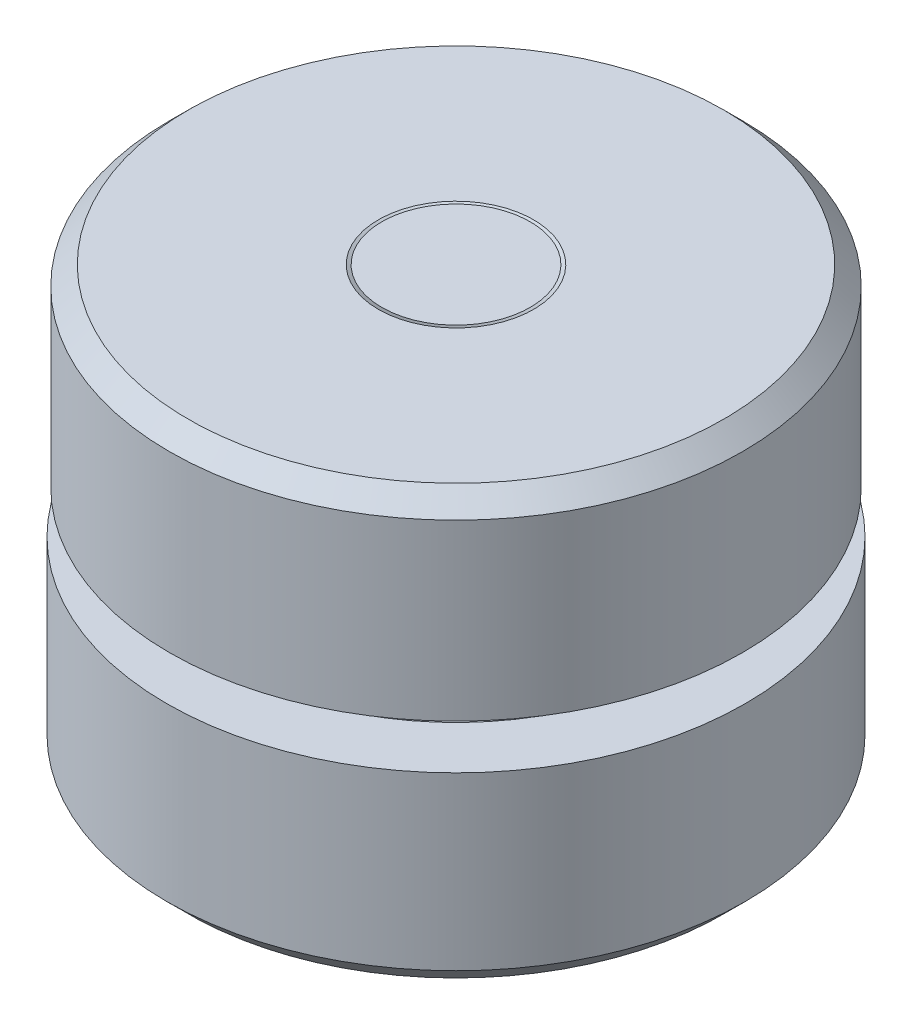
ISO-10303-21;
HEADER;
FILE_DESCRIPTION(('STEP AP214'),'2;1');
FILE_NAME('part.step','',(''),(''),'','','');
FILE_SCHEMA(('AUTOMOTIVE_DESIGN { 1 0 10303 214 1 1 1 1 }'));
ENDSEC;
DATA;
#1=APPLICATION_CONTEXT('core data for automotive mechanical design processes');
#2=APPLICATION_PROTOCOL_DEFINITION('international standard','automotive_design',2000,#1);
#3=PRODUCT_CONTEXT('',#1,'mechanical');
#4=PRODUCT('Part','Part','',(#3));
#5=PRODUCT_RELATED_PRODUCT_CATEGORY('part','',(#4));
#6=PRODUCT_DEFINITION_FORMATION('','',#4);
#7=PRODUCT_DEFINITION_CONTEXT('part definition',#1,'design');
#8=PRODUCT_DEFINITION('design','',#6,#7);
#9=PRODUCT_DEFINITION_SHAPE('','',#8);
#10=(LENGTH_UNIT() NAMED_UNIT(*) SI_UNIT(.MILLI.,.METRE.));
#11=(NAMED_UNIT(*) PLANE_ANGLE_UNIT() SI_UNIT($,.RADIAN.));
#12=(NAMED_UNIT(*) SI_UNIT($,.STERADIAN.) SOLID_ANGLE_UNIT());
#13=UNCERTAINTY_MEASURE_WITH_UNIT(LENGTH_MEASURE(1.E-05),#10,'distance_accuracy_value','');
#14=(GEOMETRIC_REPRESENTATION_CONTEXT(3) GLOBAL_UNCERTAINTY_ASSIGNED_CONTEXT((#13)) GLOBAL_UNIT_ASSIGNED_CONTEXT((#10,
#11,#12)) REPRESENTATION_CONTEXT('',''));
#15=CARTESIAN_POINT('',(0.,0.,0.));
#16=DIRECTION('',(0.,0.,1.));
#17=DIRECTION('',(1.,0.,0.));
#18=AXIS2_PLACEMENT_3D('',#15,#16,#17);
#19=CARTESIAN_POINT('',(0.,15.875,0.));
#20=DIRECTION('',(0.,-1.,0.));
#21=DIRECTION('',(0.,0.,-1.));
#22=AXIS2_PLACEMENT_3D('',#19,#20,#21);
#23=CONICAL_SURFACE('',#22,19.84375,0.78539816339745);
#24=CARTESIAN_POINT('',(0.,15.875,0.));
#25=DIRECTION('',(0.,-1.,0.));
#26=DIRECTION('',(0.,0.,-1.));
#27=AXIS2_PLACEMENT_3D('',#24,#25,#26);
#28=CIRCLE('',#27,19.84375);
#29=CARTESIAN_POINT('',(0.,15.875,-19.84375));
#30=VERTEX_POINT('',#29);
#31=EDGE_CURVE('E52',#30,#30,#28,.T.);
#32=ORIENTED_EDGE('',*,*,#31,.T.);
#33=EDGE_LOOP('',(#32));
#34=FACE_BOUND('',#33,.T.);
#35=CARTESIAN_POINT('',(0.,14.4859375,0.));
#36=DIRECTION('',(0.,-1.,0.));
#37=DIRECTION('',(0.,0.,-1.));
#38=AXIS2_PLACEMENT_3D('',#35,#36,#37);
#39=CIRCLE('',#38,21.2328125);
#40=CARTESIAN_POINT('',(0.,14.4859375,-21.2328125));
#41=VERTEX_POINT('',#40);
#42=EDGE_CURVE('E65',#41,#41,#39,.T.);
#43=ORIENTED_EDGE('',*,*,#42,.F.);
#44=EDGE_LOOP('',(#43));
#45=FACE_BOUND('',#44,.T.);
#46=ADVANCED_FACE('F41',(#34,#45),#23,.T.);
#47=CARTESIAN_POINT('',(0.,1.5875,16.8639860621043));
#48=DIRECTION('',(0.,1.,0.));
#49=DIRECTION('',(0.,0.,1.));
#50=AXIS2_PLACEMENT_3D('',#47,#48,#49);
#51=PLANE('',#50);
#52=CARTESIAN_POINT('',(0.,1.5875,0.));
#53=DIRECTION('',(0.,-1.,0.));
#54=DIRECTION('',(0.,0.,-1.));
#55=AXIS2_PLACEMENT_3D('',#52,#53,#54);
#56=CIRCLE('',#55,16.8639860621043);
#57=CARTESIAN_POINT('',(0.,1.5875,-16.8639860621043));
#58=VERTEX_POINT('',#57);
#59=EDGE_CURVE('E54',#58,#58,#56,.T.);
#60=ORIENTED_EDGE('',*,*,#59,.F.);
#61=EDGE_LOOP('',(#60));
#62=FACE_BOUND('',#61,.T.);
#63=CARTESIAN_POINT('',(0.,1.5875,0.));
#64=DIRECTION('',(0.,-1.,0.));
#65=DIRECTION('',(0.,0.,-1.));
#66=AXIS2_PLACEMENT_3D('',#63,#64,#65);
#67=CIRCLE('',#66,21.2328125);
#68=CARTESIAN_POINT('',(0.,1.58750000000001,-21.2328125));
#69=VERTEX_POINT('',#68);
#70=EDGE_CURVE('E68',#69,#69,#67,.T.);
#71=ORIENTED_EDGE('',*,*,#70,.T.);
#72=EDGE_LOOP('',(#71));
#73=FACE_BOUND('',#72,.T.);
#74=ADVANCED_FACE('F72',(#62,#73),#51,.F.);
#75=CARTESIAN_POINT('',(0.,1.5875,0.));
#76=DIRECTION('',(0.,1.,0.));
#77=DIRECTION('',(0.,0.,1.));
#78=AXIS2_PLACEMENT_3D('',#75,#76,#77);
#79=PLANE('',#78);
#80=CARTESIAN_POINT('',(0.,1.5875,0.));
#81=DIRECTION('',(0.,1.,0.));
#82=DIRECTION('',(0.,0.,1.));
#83=AXIS2_PLACEMENT_3D('',#80,#81,#82);
#84=CIRCLE('',#83,3.0036306570156);
#85=CARTESIAN_POINT('',(0.,1.5875,3.0036306570156));
#86=VERTEX_POINT('',#85);
#87=EDGE_CURVE('E62',#86,#86,#84,.T.);
#88=ORIENTED_EDGE('',*,*,#87,.T.);
#89=EDGE_LOOP('',(#88));
#90=FACE_BOUND('',#89,.T.);
#91=CARTESIAN_POINT('',(0.,1.5875,0.));
#92=DIRECTION('',(0.,-1.,0.));
#93=DIRECTION('',(0.,0.,-1.));
#94=AXIS2_PLACEMENT_3D('',#91,#92,#93);
#95=CIRCLE('',#94,4.56726393789573);
#96=CARTESIAN_POINT('',(0.,1.5875,-4.56726393789573));
#97=VERTEX_POINT('',#96);
#98=EDGE_CURVE('E57',#97,#97,#95,.T.);
#99=ORIENTED_EDGE('',*,*,#98,.T.);
#100=EDGE_LOOP('',(#99));
#101=FACE_BOUND('',#100,.T.);
#102=ADVANCED_FACE('F43',(#90,#101),#79,.F.);
#103=CARTESIAN_POINT('',(0.,15.875,19.84375));
#104=DIRECTION('',(0.,-1.,0.));
#105=DIRECTION('',(0.,0.,-1.));
#106=AXIS2_PLACEMENT_3D('',#103,#104,#105);
#107=PLANE('',#106);
#108=CARTESIAN_POINT('',(0.,15.875,0.));
#109=DIRECTION('',(0.,1.,0.));
#110=DIRECTION('',(0.,0.,1.));
#111=AXIS2_PLACEMENT_3D('',#108,#109,#110);
#112=CIRCLE('',#111,5.7532613140312);
#113=CARTESIAN_POINT('',(0.,15.875,5.7532613140312));
#114=VERTEX_POINT('',#113);
#115=EDGE_CURVE('E11',#114,#114,#112,.T.);
#116=ORIENTED_EDGE('',*,*,#115,.F.);
#117=EDGE_LOOP('',(#116));
#118=FACE_BOUND('',#117,.T.);
#119=ORIENTED_EDGE('',*,*,#31,.F.);
#120=EDGE_LOOP('',(#119));
#121=FACE_BOUND('',#120,.T.);
#122=ADVANCED_FACE('F98',(#118,#121),#107,.F.);
#123=CARTESIAN_POINT('',(0.,0.,0.));
#124=DIRECTION('',(0.,-1.,0.));
#125=DIRECTION('',(0.,0.,-1.));
#126=AXIS2_PLACEMENT_3D('',#123,#124,#125);
#127=TOROIDAL_SURFACE('',#126,10.715625,6.35);
#128=ORIENTED_EDGE('',*,*,#98,.F.);
#129=EDGE_LOOP('',(#128));
#130=FACE_BOUND('',#129,.T.);
#131=ORIENTED_EDGE('',*,*,#59,.T.);
#132=EDGE_LOOP('',(#131));
#133=FACE_BOUND('',#132,.T.);
#134=ADVANCED_FACE('F90',(#130,#133),#127,.F.);
#135=CARTESIAN_POINT('',(0.,15.875,0.));
#136=DIRECTION('',(0.,1.,0.));
#137=DIRECTION('',(0.,0.,1.));
#138=AXIS2_PLACEMENT_3D('',#135,#136,#137);
#139=CYLINDRICAL_SURFACE('',#138,3.0036306570156);
#140=CARTESIAN_POINT('',(0.,14.2875,0.));
#141=DIRECTION('',(0.,1.,0.));
#142=DIRECTION('',(0.,0.,1.));
#143=AXIS2_PLACEMENT_3D('',#140,#141,#142);
#144=CIRCLE('',#143,3.0036306570156);
#145=CARTESIAN_POINT('',(0.,14.2875,3.0036306570156));
#146=VERTEX_POINT('',#145);
#147=EDGE_CURVE('E45',#146,#146,#144,.T.);
#148=ORIENTED_EDGE('',*,*,#147,.T.);
#149=EDGE_LOOP('',(#148));
#150=FACE_BOUND('',#149,.T.);
#151=ORIENTED_EDGE('',*,*,#87,.F.);
#152=EDGE_LOOP('',(#151));
#153=FACE_BOUND('',#152,.T.);
#154=ADVANCED_FACE('F94',(#150,#153),#139,.F.);
#155=CARTESIAN_POINT('',(0.,15.875,0.));
#156=DIRECTION('',(0.,1.,0.));
#157=DIRECTION('',(0.,0.,1.));
#158=AXIS2_PLACEMENT_3D('',#155,#156,#157);
#159=CONICAL_SURFACE('',#158,5.7532613140312,1.0471975511966);
#160=ORIENTED_EDGE('',*,*,#147,.F.);
#161=EDGE_LOOP('',(#160));
#162=FACE_BOUND('',#161,.T.);
#163=ORIENTED_EDGE('',*,*,#115,.T.);
#164=EDGE_LOOP('',(#163));
#165=FACE_BOUND('',#164,.T.);
#166=ADVANCED_FACE('F77',(#162,#165),#159,.F.);
#167=CARTESIAN_POINT('',(0.,-15.875,0.));
#168=DIRECTION('',(0.,-1.,0.));
#169=DIRECTION('',(0.,0.,-1.));
#170=AXIS2_PLACEMENT_3D('',#167,#168,#169);
#171=CYLINDRICAL_SURFACE('',#170,21.2328125);
#172=ORIENTED_EDGE('',*,*,#70,.F.);
#173=EDGE_LOOP('',(#172));
#174=FACE_BOUND('',#173,.T.);
#175=ORIENTED_EDGE('',*,*,#42,.T.);
#176=EDGE_LOOP('',(#175));
#177=FACE_BOUND('',#176,.T.);
#178=ADVANCED_FACE('F74',(#174,#177),#171,.T.);
#179=CLOSED_SHELL('',(#46,#74,#102,#122,#134,#154,#166,#178));
#180=MANIFOLD_SOLID_BREP('B2',#179);
#181=CARTESIAN_POINT('',(0.,-15.875,19.84375));
#182=DIRECTION('',(0.,1.,0.));
#183=DIRECTION('',(0.,0.,1.));
#184=AXIS2_PLACEMENT_3D('',#181,#182,#183);
#185=PLANE('',#184);
#186=CARTESIAN_POINT('',(0.,-15.875,0.));
#187=DIRECTION('',(0.,1.,0.));
#188=DIRECTION('',(0.,0.,1.));
#189=AXIS2_PLACEMENT_3D('',#186,#187,#188);
#190=CIRCLE('',#189,5.7532613140312);
#191=CARTESIAN_POINT('',(0.,-15.875,5.7532613140312));
#192=VERTEX_POINT('',#191);
#193=EDGE_CURVE('E171',#192,#192,#190,.T.);
#194=ORIENTED_EDGE('',*,*,#193,.T.);
#195=EDGE_LOOP('',(#194));
#196=FACE_BOUND('',#195,.T.);
#197=CARTESIAN_POINT('',(0.,-15.875,0.));
#198=DIRECTION('',(0.,-1.,0.));
#199=DIRECTION('',(0.,0.,-1.));
#200=AXIS2_PLACEMENT_3D('',#197,#198,#199);
#201=CIRCLE('',#200,19.84375);
#202=CARTESIAN_POINT('',(0.,-15.875,-19.84375));
#203=VERTEX_POINT('',#202);
#204=EDGE_CURVE('E191',#203,#203,#201,.T.);
#205=ORIENTED_EDGE('',*,*,#204,.T.);
#206=EDGE_LOOP('',(#205));
#207=FACE_BOUND('',#206,.T.);
#208=ADVANCED_FACE('F168',(#196,#207),#185,.F.);
#209=CARTESIAN_POINT('',(0.,-1.5875,0.));
#210=DIRECTION('',(0.,-1.,0.));
#211=DIRECTION('',(0.,0.,-1.));
#212=AXIS2_PLACEMENT_3D('',#209,#210,#211);
#213=PLANE('',#212);
#214=CARTESIAN_POINT('',(0.,-1.5875,0.));
#215=DIRECTION('',(0.,-1.,0.));
#216=DIRECTION('',(0.,0.,-1.));
#217=AXIS2_PLACEMENT_3D('',#214,#215,#216);
#218=CIRCLE('',#217,3.0036306570156);
#219=CARTESIAN_POINT('',(0.,-1.5875,-3.0036306570156));
#220=VERTEX_POINT('',#219);
#221=EDGE_CURVE('E190',#220,#220,#218,.T.);
#222=ORIENTED_EDGE('',*,*,#221,.T.);
#223=EDGE_LOOP('',(#222));
#224=FACE_BOUND('',#223,.T.);
#225=CARTESIAN_POINT('',(0.,-1.5875,0.));
#226=DIRECTION('',(0.,-1.,0.));
#227=DIRECTION('',(0.,0.,-1.));
#228=AXIS2_PLACEMENT_3D('',#225,#226,#227);
#229=CIRCLE('',#228,4.56726393789573);
#230=CARTESIAN_POINT('',(0.,-1.5875,-4.56726393789573));
#231=VERTEX_POINT('',#230);
#232=EDGE_CURVE('E175',#231,#231,#229,.T.);
#233=ORIENTED_EDGE('',*,*,#232,.F.);
#234=EDGE_LOOP('',(#233));
#235=FACE_BOUND('',#234,.T.);
#236=ADVANCED_FACE('F197',(#224,#235),#213,.F.);
#237=CARTESIAN_POINT('',(0.,-14.2875,0.));
#238=DIRECTION('',(0.,1.,0.));
#239=DIRECTION('',(0.,0.,1.));
#240=AXIS2_PLACEMENT_3D('',#237,#238,#239);
#241=CONICAL_SURFACE('',#240,21.43125,0.78539816339745);
#242=ORIENTED_EDGE('',*,*,#204,.F.);
#243=EDGE_LOOP('',(#242));
#244=FACE_BOUND('',#243,.T.);
#245=CARTESIAN_POINT('',(0.,-14.2875,0.));
#246=DIRECTION('',(0.,-1.,0.));
#247=DIRECTION('',(0.,0.,-1.));
#248=AXIS2_PLACEMENT_3D('',#245,#246,#247);
#249=CIRCLE('',#248,21.43125);
#250=CARTESIAN_POINT('',(0.,-14.2875,-21.43125));
#251=VERTEX_POINT('',#250);
#252=EDGE_CURVE('E187',#251,#251,#249,.T.);
#253=ORIENTED_EDGE('',*,*,#252,.T.);
#254=EDGE_LOOP('',(#253));
#255=FACE_BOUND('',#254,.T.);
#256=ADVANCED_FACE('F220',(#244,#255),#241,.T.);
#257=CARTESIAN_POINT('',(0.,-15.875,0.));
#258=DIRECTION('',(0.,-1.,0.));
#259=DIRECTION('',(0.,0.,-1.));
#260=AXIS2_PLACEMENT_3D('',#257,#258,#259);
#261=CYLINDRICAL_SURFACE('',#260,21.43125);
#262=ORIENTED_EDGE('',*,*,#252,.F.);
#263=EDGE_LOOP('',(#262));
#264=FACE_BOUND('',#263,.T.);
#265=CARTESIAN_POINT('',(0.,-1.5875,0.));
#266=DIRECTION('',(0.,-1.,0.));
#267=DIRECTION('',(0.,0.,-1.));
#268=AXIS2_PLACEMENT_3D('',#265,#266,#267);
#269=CIRCLE('',#268,21.43125);
#270=CARTESIAN_POINT('',(0.,-1.5875,-21.43125));
#271=VERTEX_POINT('',#270);
#272=EDGE_CURVE('E184',#271,#271,#269,.T.);
#273=ORIENTED_EDGE('',*,*,#272,.T.);
#274=EDGE_LOOP('',(#273));
#275=FACE_BOUND('',#274,.T.);
#276=ADVANCED_FACE('F228',(#264,#275),#261,.T.);
#277=CARTESIAN_POINT('',(0.,-1.5875,16.8639860621043));
#278=DIRECTION('',(0.,-1.,0.));
#279=DIRECTION('',(0.,0.,-1.));
#280=AXIS2_PLACEMENT_3D('',#277,#278,#279);
#281=PLANE('',#280);
#282=ORIENTED_EDGE('',*,*,#272,.F.);
#283=EDGE_LOOP('',(#282));
#284=FACE_BOUND('',#283,.T.);
#285=CARTESIAN_POINT('',(0.,-1.5875,0.));
#286=DIRECTION('',(0.,-1.,0.));
#287=DIRECTION('',(0.,0.,-1.));
#288=AXIS2_PLACEMENT_3D('',#285,#286,#287);
#289=CIRCLE('',#288,16.8639860621043);
#290=CARTESIAN_POINT('',(0.,-1.5875,-16.8639860621043));
#291=VERTEX_POINT('',#290);
#292=EDGE_CURVE('E179',#291,#291,#289,.T.);
#293=ORIENTED_EDGE('',*,*,#292,.T.);
#294=EDGE_LOOP('',(#293));
#295=FACE_BOUND('',#294,.T.);
#296=ADVANCED_FACE('F212',(#284,#295),#281,.F.);
#297=CARTESIAN_POINT('',(0.,0.,0.));
#298=DIRECTION('',(0.,-1.,0.));
#299=DIRECTION('',(0.,0.,-1.));
#300=AXIS2_PLACEMENT_3D('',#297,#298,#299);
#301=TOROIDAL_SURFACE('',#300,10.715625,6.35);
#302=ORIENTED_EDGE('',*,*,#292,.F.);
#303=EDGE_LOOP('',(#302));
#304=FACE_BOUND('',#303,.T.);
#305=ORIENTED_EDGE('',*,*,#232,.T.);
#306=EDGE_LOOP('',(#305));
#307=FACE_BOUND('',#306,.T.);
#308=ADVANCED_FACE('F203',(#304,#307),#301,.F.);
#309=CARTESIAN_POINT('',(0.,15.875,0.));
#310=DIRECTION('',(0.,1.,0.));
#311=DIRECTION('',(0.,0.,1.));
#312=AXIS2_PLACEMENT_3D('',#309,#310,#311);
#313=CYLINDRICAL_SURFACE('',#312,3.0036306570156);
#314=CARTESIAN_POINT('',(0.,-14.2875,0.));
#315=DIRECTION('',(0.,1.,0.));
#316=DIRECTION('',(0.,0.,1.));
#317=AXIS2_PLACEMENT_3D('',#314,#315,#316);
#318=CIRCLE('',#317,3.0036306570156);
#319=CARTESIAN_POINT('',(0.,-14.2875,3.0036306570156));
#320=VERTEX_POINT('',#319);
#321=EDGE_CURVE('E40',#320,#320,#318,.T.);
#322=ORIENTED_EDGE('',*,*,#321,.F.);
#323=EDGE_LOOP('',(#322));
#324=FACE_BOUND('',#323,.T.);
#325=ORIENTED_EDGE('',*,*,#221,.F.);
#326=EDGE_LOOP('',(#325));
#327=FACE_BOUND('',#326,.T.);
#328=ADVANCED_FACE('F200',(#324,#327),#313,.F.);
#329=CARTESIAN_POINT('',(0.,-14.2875,0.));
#330=DIRECTION('',(0.,-1.,0.));
#331=DIRECTION('',(0.,0.,-1.));
#332=AXIS2_PLACEMENT_3D('',#329,#330,#331);
#333=CONICAL_SURFACE('',#332,3.0036306570156,1.0471975511966);
#334=ORIENTED_EDGE('',*,*,#193,.F.);
#335=EDGE_LOOP('',(#334));
#336=FACE_BOUND('',#335,.T.);
#337=ORIENTED_EDGE('',*,*,#321,.T.);
#338=EDGE_LOOP('',(#337));
#339=FACE_BOUND('',#338,.T.);
#340=ADVANCED_FACE('F202',(#336,#339),#333,.F.);
#341=CLOSED_SHELL('',(#208,#236,#256,#276,#296,#308,#328,#340));
#342=MANIFOLD_SOLID_BREP('B6',#341);
#343=CARTESIAN_POINT('',(-10.715625,0.,1.12240214164623E-13));
#344=DIRECTION('',(0.,1.,0.));
#345=DIRECTION('',(1.,0.,0.));
#346=AXIS2_PLACEMENT_3D('',#343,#344,#345);
#347=SPHERICAL_SURFACE('',#346,6.35);
#348=CARTESIAN_POINT('',(-10.715625,6.35,1.12240214164623E-13));
#349=VERTEX_POINT('',#348);
#350=VERTEX_LOOP('',#349);
#351=FACE_BOUND('',#350,.T.);
#352=ADVANCED_FACE('F295',(#351),#347,.T.);
#353=CLOSED_SHELL('',(#352));
#354=MANIFOLD_SOLID_BREP('B35',#353);
#355=CARTESIAN_POINT('',(0.,0.,-10.715625));
#356=DIRECTION('',(0.,1.,0.));
#357=DIRECTION('',(0.,0.,1.));
#358=AXIS2_PLACEMENT_3D('',#355,#356,#357);
#359=SPHERICAL_SURFACE('',#358,6.35);
#360=CARTESIAN_POINT('',(0.,6.35,-10.715625));
#361=VERTEX_POINT('',#360);
#362=VERTEX_LOOP('',#361);
#363=FACE_BOUND('',#362,.T.);
#364=ADVANCED_FACE('F326',(#363),#359,.T.);
#365=CLOSED_SHELL('',(#364));
#366=MANIFOLD_SOLID_BREP('B164',#365);
#367=CARTESIAN_POINT('',(10.715625,0.,0.));
#368=DIRECTION('',(0.,1.,0.));
#369=DIRECTION('',(-1.,0.,0.));
#370=AXIS2_PLACEMENT_3D('',#367,#368,#369);
#371=SPHERICAL_SURFACE('',#370,6.35);
#372=CARTESIAN_POINT('',(10.715625,6.35,0.));
#373=VERTEX_POINT('',#372);
#374=VERTEX_LOOP('',#373);
#375=FACE_BOUND('',#374,.T.);
#376=ADVANCED_FACE('F357',(#375),#371,.T.);
#377=CLOSED_SHELL('',(#376));
#378=MANIFOLD_SOLID_BREP('B291',#377);
#379=CARTESIAN_POINT('',(0.,0.,10.715625));
#380=DIRECTION('',(0.,1.,0.));
#381=DIRECTION('',(0.,0.,-1.));
#382=AXIS2_PLACEMENT_3D('',#379,#380,#381);
#383=SPHERICAL_SURFACE('',#382,6.35);
#384=CARTESIAN_POINT('',(0.,6.35,10.715625));
#385=VERTEX_POINT('',#384);
#386=VERTEX_LOOP('',#385);
#387=FACE_BOUND('',#386,.T.);
#388=ADVANCED_FACE('F390',(#387),#383,.T.);
#389=CLOSED_SHELL('',(#388));
#390=MANIFOLD_SOLID_BREP('B322',#389);
#391=CARTESIAN_POINT('',(0.,-1.5875,0.));
#392=DIRECTION('',(0.,-1.,0.));
#393=DIRECTION('',(0.,0.,-1.));
#394=AXIS2_PLACEMENT_3D('',#391,#392,#393);
#395=PLANE('',#394);
#396=CARTESIAN_POINT('',(0.,-1.5875,0.));
#397=DIRECTION('',(0.,-1.,0.));
#398=DIRECTION('',(0.,0.,-1.));
#399=AXIS2_PLACEMENT_3D('',#396,#397,#398);
#400=CIRCLE('',#399,2.8766306570156);
#401=CARTESIAN_POINT('',(0.,-1.5875,-2.8766306570156));
#402=VERTEX_POINT('',#401);
#403=EDGE_CURVE('E389',#402,#402,#400,.F.);
#404=ORIENTED_EDGE('',*,*,#403,.T.);
#405=EDGE_LOOP('',(#404));
#406=FACE_BOUND('',#405,.T.);
#407=ADVANCED_FACE('F409',(#406),#395,.F.);
#408=CARTESIAN_POINT('',(0.,15.875,0.));
#409=DIRECTION('',(0.,1.,0.));
#410=DIRECTION('',(0.,0.,1.));
#411=AXIS2_PLACEMENT_3D('',#408,#409,#410);
#412=CYLINDRICAL_SURFACE('',#411,2.8766306570156);
#413=CARTESIAN_POINT('',(0.,-14.3608234841871,0.));
#414=DIRECTION('',(0.,1.,0.));
#415=DIRECTION('',(0.,0.,1.));
#416=AXIS2_PLACEMENT_3D('',#413,#414,#415);
#417=CIRCLE('',#416,2.8766306570156);
#418=CARTESIAN_POINT('',(0.,-14.3608234841871,2.8766306570156));
#419=VERTEX_POINT('',#418);
#420=EDGE_CURVE('E420',#419,#419,#417,.T.);
#421=ORIENTED_EDGE('',*,*,#420,.T.);
#422=EDGE_LOOP('',(#421));
#423=FACE_BOUND('',#422,.T.);
#424=ORIENTED_EDGE('',*,*,#403,.F.);
#425=EDGE_LOOP('',(#424));
#426=FACE_BOUND('',#425,.T.);
#427=ADVANCED_FACE('F427',(#423,#426),#412,.T.);
#428=CARTESIAN_POINT('',(0.,-15.875,0.));
#429=DIRECTION('',(0.,-1.,0.));
#430=DIRECTION('',(0.,0.,-1.));
#431=AXIS2_PLACEMENT_3D('',#428,#429,#430);
#432=CONICAL_SURFACE('',#431,5.4992613140312,1.0471975511966);
#433=ORIENTED_EDGE('',*,*,#420,.F.);
#434=EDGE_LOOP('',(#433));
#435=FACE_BOUND('',#434,.T.);
#436=CARTESIAN_POINT('',(0.,-15.875,0.));
#437=DIRECTION('',(0.,1.,0.));
#438=DIRECTION('',(0.,0.,1.));
#439=AXIS2_PLACEMENT_3D('',#436,#437,#438);
#440=CIRCLE('',#439,5.4992613140312);
#441=CARTESIAN_POINT('',(0.,-15.875,5.4992613140312));
#442=VERTEX_POINT('',#441);
#443=EDGE_CURVE('E416',#442,#442,#440,.T.);
#444=ORIENTED_EDGE('',*,*,#443,.T.);
#445=EDGE_LOOP('',(#444));
#446=FACE_BOUND('',#445,.T.);
#447=ADVANCED_FACE('F430',(#435,#446),#432,.T.);
#448=CARTESIAN_POINT('',(0.,-15.875,19.84375));
#449=DIRECTION('',(0.,1.,0.));
#450=DIRECTION('',(0.,0.,1.));
#451=AXIS2_PLACEMENT_3D('',#448,#449,#450);
#452=PLANE('',#451);
#453=ORIENTED_EDGE('',*,*,#443,.F.);
#454=EDGE_LOOP('',(#453));
#455=FACE_BOUND('',#454,.T.);
#456=ADVANCED_FACE('F411',(#455),#452,.F.);
#457=CLOSED_SHELL('',(#407,#427,#447,#456));
#458=MANIFOLD_SOLID_BREP('B353',#457);
#459=CARTESIAN_POINT('',(0.,15.875,19.84375));
#460=DIRECTION('',(0.,-1.,0.));
#461=DIRECTION('',(0.,0.,-1.));
#462=AXIS2_PLACEMENT_3D('',#459,#460,#461);
#463=PLANE('',#462);
#464=CARTESIAN_POINT('',(0.,15.875,0.));
#465=DIRECTION('',(0.,1.,0.));
#466=DIRECTION('',(0.,0.,1.));
#467=AXIS2_PLACEMENT_3D('',#464,#465,#466);
#468=CIRCLE('',#467,5.4992613140312);
#469=CARTESIAN_POINT('',(0.,15.875,5.4992613140312));
#470=VERTEX_POINT('',#469);
#471=EDGE_CURVE('E475',#470,#470,#468,.T.);
#472=ORIENTED_EDGE('',*,*,#471,.T.);
#473=EDGE_LOOP('',(#472));
#474=FACE_BOUND('',#473,.T.);
#475=ADVANCED_FACE('F464',(#474),#463,.F.);
#476=CARTESIAN_POINT('',(0.,14.3608234841871,0.));
#477=DIRECTION('',(0.,1.,0.));
#478=DIRECTION('',(0.,0.,1.));
#479=AXIS2_PLACEMENT_3D('',#476,#477,#478);
#480=CONICAL_SURFACE('',#479,2.8766306570156,1.0471975511966);
#481=ORIENTED_EDGE('',*,*,#471,.F.);
#482=EDGE_LOOP('',(#481));
#483=FACE_BOUND('',#482,.T.);
#484=CARTESIAN_POINT('',(0.,14.3608234841871,0.));
#485=DIRECTION('',(0.,1.,0.));
#486=DIRECTION('',(0.,0.,1.));
#487=AXIS2_PLACEMENT_3D('',#484,#485,#486);
#488=CIRCLE('',#487,2.8766306570156);
#489=CARTESIAN_POINT('',(0.,14.3608234841871,2.8766306570156));
#490=VERTEX_POINT('',#489);
#491=EDGE_CURVE('E471',#490,#490,#488,.T.);
#492=ORIENTED_EDGE('',*,*,#491,.T.);
#493=EDGE_LOOP('',(#492));
#494=FACE_BOUND('',#493,.T.);
#495=ADVANCED_FACE('F483',(#483,#494),#480,.T.);
#496=CARTESIAN_POINT('',(0.,15.875,0.));
#497=DIRECTION('',(0.,1.,0.));
#498=DIRECTION('',(0.,0.,1.));
#499=AXIS2_PLACEMENT_3D('',#496,#497,#498);
#500=CYLINDRICAL_SURFACE('',#499,2.8766306570156);
#501=ORIENTED_EDGE('',*,*,#491,.F.);
#502=EDGE_LOOP('',(#501));
#503=FACE_BOUND('',#502,.T.);
#504=CARTESIAN_POINT('',(0.,1.5875,0.));
#505=DIRECTION('',(0.,1.,0.));
#506=DIRECTION('',(0.,0.,1.));
#507=AXIS2_PLACEMENT_3D('',#504,#505,#506);
#508=CIRCLE('',#507,2.8766306570156);
#509=CARTESIAN_POINT('',(0.,1.5875,2.8766306570156));
#510=VERTEX_POINT('',#509);
#511=EDGE_CURVE('E408',#510,#510,#508,.F.);
#512=ORIENTED_EDGE('',*,*,#511,.F.);
#513=EDGE_LOOP('',(#512));
#514=FACE_BOUND('',#513,.T.);
#515=ADVANCED_FACE('F485',(#503,#514),#500,.T.);
#516=CARTESIAN_POINT('',(0.,1.5875,0.));
#517=DIRECTION('',(0.,1.,0.));
#518=DIRECTION('',(0.,0.,1.));
#519=AXIS2_PLACEMENT_3D('',#516,#517,#518);
#520=PLANE('',#519);
#521=ORIENTED_EDGE('',*,*,#511,.T.);
#522=EDGE_LOOP('',(#521));
#523=FACE_BOUND('',#522,.T.);
#524=ADVANCED_FACE('F466',(#523),#520,.F.);
#525=CLOSED_SHELL('',(#475,#495,#515,#524));
#526=MANIFOLD_SOLID_BREP('B384',#525);
#527=ADVANCED_BREP_SHAPE_REPRESENTATION('',(#18,#180,#342,#354,#366,#378,#390,#458,#526),#14);
#528=SHAPE_DEFINITION_REPRESENTATION(#9,#527);
ENDSEC;
END-ISO-10303-21;
